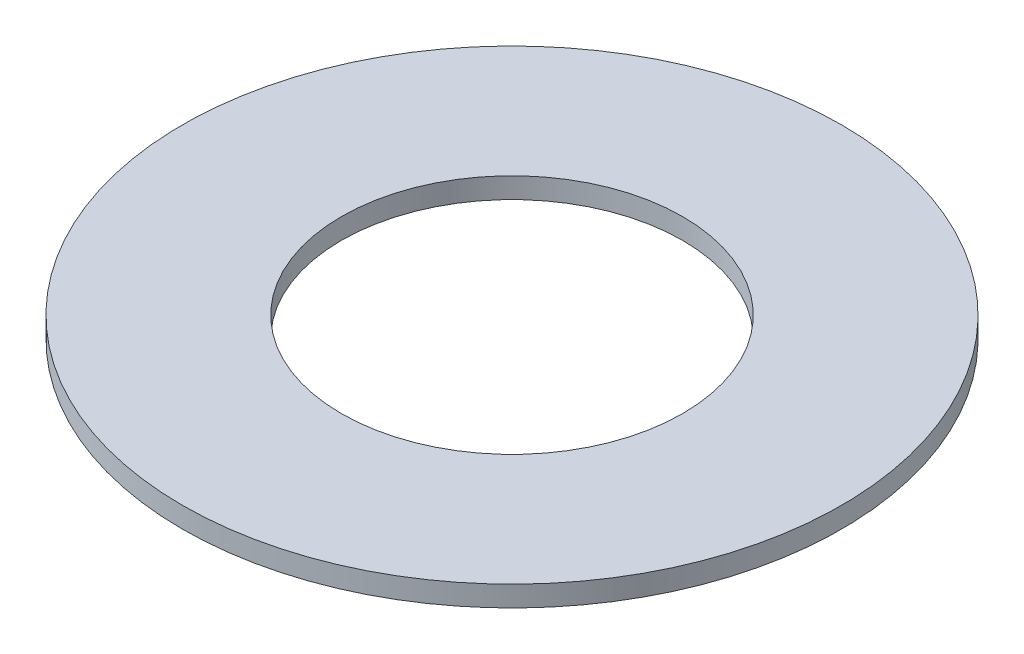
ISO-10303-21;
HEADER;
FILE_DESCRIPTION(('STEP AP214'),'2;1');
FILE_NAME('part.step','',(''),(''),'','','');
FILE_SCHEMA(('AUTOMOTIVE_DESIGN { 1 0 10303 214 1 1 1 1 }'));
ENDSEC;
DATA;
#1=APPLICATION_CONTEXT('core data for automotive mechanical design processes');
#2=APPLICATION_PROTOCOL_DEFINITION('international standard','automotive_design',2000,#1);
#3=PRODUCT_CONTEXT('',#1,'mechanical');
#4=PRODUCT('Part','Part','',(#3));
#5=PRODUCT_RELATED_PRODUCT_CATEGORY('part','',(#4));
#6=PRODUCT_DEFINITION_FORMATION('','',#4);
#7=PRODUCT_DEFINITION_CONTEXT('part definition',#1,'design');
#8=PRODUCT_DEFINITION('design','',#6,#7);
#9=PRODUCT_DEFINITION_SHAPE('','',#8);
#10=(LENGTH_UNIT() NAMED_UNIT(*) SI_UNIT(.MILLI.,.METRE.));
#11=(NAMED_UNIT(*) PLANE_ANGLE_UNIT() SI_UNIT($,.RADIAN.));
#12=(NAMED_UNIT(*) SI_UNIT($,.STERADIAN.) SOLID_ANGLE_UNIT());
#13=UNCERTAINTY_MEASURE_WITH_UNIT(LENGTH_MEASURE(1.E-05),#10,'distance_accuracy_value','');
#14=(GEOMETRIC_REPRESENTATION_CONTEXT(3) GLOBAL_UNCERTAINTY_ASSIGNED_CONTEXT((#13)) GLOBAL_UNIT_ASSIGNED_CONTEXT((#10,
#11,#12)) REPRESENTATION_CONTEXT('',''));
#15=CARTESIAN_POINT('',(0.,0.,0.));
#16=DIRECTION('',(0.,0.,1.));
#17=DIRECTION('',(1.,0.,0.));
#18=AXIS2_PLACEMENT_3D('',#15,#16,#17);
#19=CARTESIAN_POINT('',(0.,4.76,0.));
#20=DIRECTION('',(0.,1.,0.));
#21=DIRECTION('',(0.,0.,1.));
#22=AXIS2_PLACEMENT_3D('',#19,#20,#21);
#23=PLANE('',#22);
#24=CARTESIAN_POINT('',(0.,4.76,0.));
#25=DIRECTION('',(0.,1.,0.));
#26=DIRECTION('',(0.,0.,1.));
#27=AXIS2_PLACEMENT_3D('',#24,#25,#26);
#28=CIRCLE('',#27,76.);
#29=CARTESIAN_POINT('',(0.,4.76,76.));
#30=VERTEX_POINT('',#29);
#31=EDGE_CURVE('E10',#30,#30,#28,.T.);
#32=ORIENTED_EDGE('',*,*,#31,.T.);
#33=EDGE_LOOP('',(#32));
#34=FACE_BOUND('',#33,.T.);
#35=CARTESIAN_POINT('',(0.,4.76,0.));
#36=DIRECTION('',(0.,1.,0.));
#37=DIRECTION('',(0.,0.,1.));
#38=AXIS2_PLACEMENT_3D('',#35,#36,#37);
#39=CIRCLE('',#38,39.35);
#40=CARTESIAN_POINT('',(0.,4.76,39.35));
#41=VERTEX_POINT('',#40);
#42=EDGE_CURVE('E56',#41,#41,#39,.T.);
#43=ORIENTED_EDGE('',*,*,#42,.F.);
#44=EDGE_LOOP('',(#43));
#45=FACE_BOUND('',#44,.T.);
#46=ADVANCED_FACE('F43',(#34,#45),#23,.T.);
#47=CARTESIAN_POINT('',(0.,0.,0.));
#48=DIRECTION('',(0.,1.,0.));
#49=DIRECTION('',(0.,0.,1.));
#50=AXIS2_PLACEMENT_3D('',#47,#48,#49);
#51=PLANE('',#50);
#52=CARTESIAN_POINT('',(0.,0.,0.));
#53=DIRECTION('',(0.,1.,0.));
#54=DIRECTION('',(0.,0.,1.));
#55=AXIS2_PLACEMENT_3D('',#52,#53,#54);
#56=CIRCLE('',#55,76.);
#57=CARTESIAN_POINT('',(0.,0.,76.));
#58=VERTEX_POINT('',#57);
#59=EDGE_CURVE('E47',#58,#58,#56,.T.);
#60=ORIENTED_EDGE('',*,*,#59,.F.);
#61=EDGE_LOOP('',(#60));
#62=FACE_BOUND('',#61,.T.);
#63=CARTESIAN_POINT('',(0.,0.,0.));
#64=DIRECTION('',(0.,1.,0.));
#65=DIRECTION('',(0.,0.,1.));
#66=AXIS2_PLACEMENT_3D('',#63,#64,#65);
#67=CIRCLE('',#66,39.35);
#68=CARTESIAN_POINT('',(0.,0.,39.35));
#69=VERTEX_POINT('',#68);
#70=EDGE_CURVE('E58',#69,#69,#67,.T.);
#71=ORIENTED_EDGE('',*,*,#70,.T.);
#72=EDGE_LOOP('',(#71));
#73=FACE_BOUND('',#72,.T.);
#74=ADVANCED_FACE('F70',(#62,#73),#51,.F.);
#75=CARTESIAN_POINT('',(0.,4.76,0.));
#76=DIRECTION('',(0.,-1.,0.));
#77=DIRECTION('',(0.,0.,-1.));
#78=AXIS2_PLACEMENT_3D('',#75,#76,#77);
#79=CYLINDRICAL_SURFACE('',#78,76.);
#80=ORIENTED_EDGE('',*,*,#31,.F.);
#81=EDGE_LOOP('',(#80));
#82=FACE_BOUND('',#81,.T.);
#83=ORIENTED_EDGE('',*,*,#59,.T.);
#84=EDGE_LOOP('',(#83));
#85=FACE_BOUND('',#84,.T.);
#86=ADVANCED_FACE('F45',(#82,#85),#79,.T.);
#87=CARTESIAN_POINT('',(0.,4.76,0.));
#88=DIRECTION('',(0.,-1.,0.));
#89=DIRECTION('',(0.,0.,-1.));
#90=AXIS2_PLACEMENT_3D('',#87,#88,#89);
#91=CYLINDRICAL_SURFACE('',#90,39.35);
#92=ORIENTED_EDGE('',*,*,#42,.T.);
#93=EDGE_LOOP('',(#92));
#94=FACE_BOUND('',#93,.T.);
#95=ORIENTED_EDGE('',*,*,#70,.F.);
#96=EDGE_LOOP('',(#95));
#97=FACE_BOUND('',#96,.T.);
#98=ADVANCED_FACE('F66',(#94,#97),#91,.F.);
#99=CLOSED_SHELL('',(#46,#74,#86,#98));
#100=MANIFOLD_SOLID_BREP('B2',#99);
#101=ADVANCED_BREP_SHAPE_REPRESENTATION('',(#18,#100),#14);
#102=SHAPE_DEFINITION_REPRESENTATION(#9,#101);
ENDSEC;
END-ISO-10303-21;
